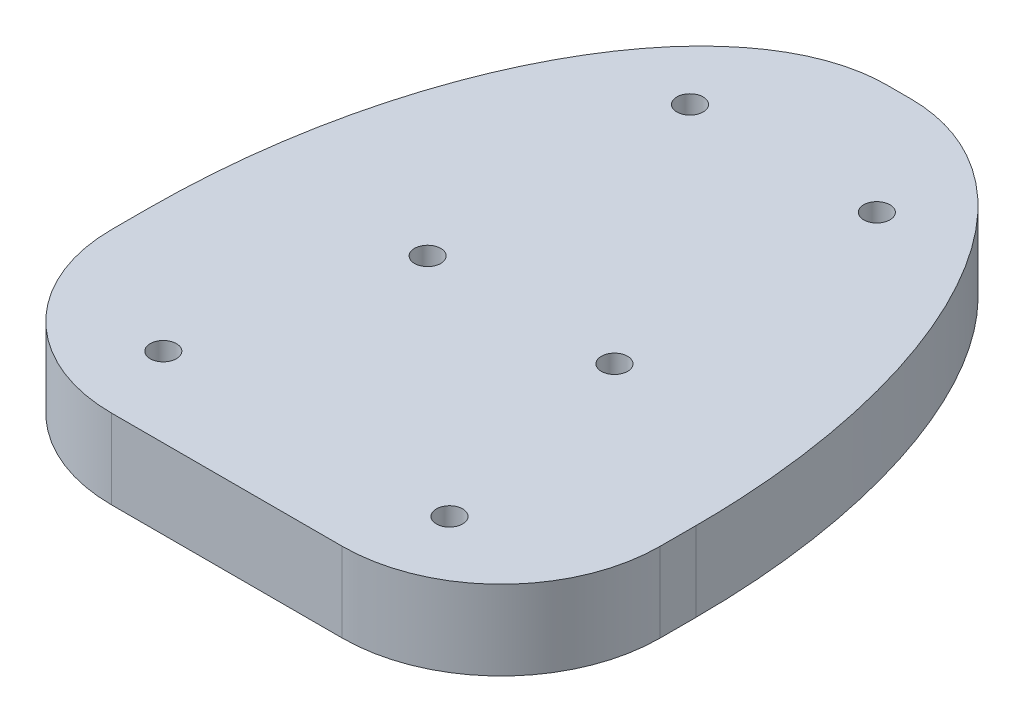
ISO-10303-21;
HEADER;
FILE_DESCRIPTION(('STEP AP214'),'2;1');
FILE_NAME('part.step','',(''),(''),'','','');
FILE_SCHEMA(('AUTOMOTIVE_DESIGN { 1 0 10303 214 1 1 1 1 }'));
ENDSEC;
DATA;
#1=APPLICATION_CONTEXT('core data for automotive mechanical design processes');
#2=APPLICATION_PROTOCOL_DEFINITION('international standard','automotive_design',2000,#1);
#3=PRODUCT_CONTEXT('',#1,'mechanical');
#4=PRODUCT('Part','Part','',(#3));
#5=PRODUCT_RELATED_PRODUCT_CATEGORY('part','',(#4));
#6=PRODUCT_DEFINITION_FORMATION('','',#4);
#7=PRODUCT_DEFINITION_CONTEXT('part definition',#1,'design');
#8=PRODUCT_DEFINITION('design','',#6,#7);
#9=PRODUCT_DEFINITION_SHAPE('','',#8);
#10=(LENGTH_UNIT() NAMED_UNIT(*) SI_UNIT(.MILLI.,.METRE.));
#11=(NAMED_UNIT(*) PLANE_ANGLE_UNIT() SI_UNIT($,.RADIAN.));
#12=(NAMED_UNIT(*) SI_UNIT($,.STERADIAN.) SOLID_ANGLE_UNIT());
#13=UNCERTAINTY_MEASURE_WITH_UNIT(LENGTH_MEASURE(1.E-05),#10,'distance_accuracy_value','');
#14=(GEOMETRIC_REPRESENTATION_CONTEXT(3) GLOBAL_UNCERTAINTY_ASSIGNED_CONTEXT((#13)) GLOBAL_UNIT_ASSIGNED_CONTEXT((#10,
#11,#12)) REPRESENTATION_CONTEXT('',''));
#15=CARTESIAN_POINT('',(0.,0.,0.));
#16=DIRECTION('',(0.,0.,1.));
#17=DIRECTION('',(1.,0.,0.));
#18=AXIS2_PLACEMENT_3D('',#15,#16,#17);
#19=CARTESIAN_POINT('',(-50.,10.,50.));
#20=DIRECTION('',(0.,0.,-1.));
#21=DIRECTION('',(-1.,0.,0.));
#22=AXIS2_PLACEMENT_3D('',#19,#20,#21);
#23=PLANE('',#22);
#24=DIRECTION('',(1.,0.,0.));
#25=VECTOR('',#24,1.);
#26=CARTESIAN_POINT('',(-50.,0.,50.));
#27=LINE('',#26,#25);
#28=CARTESIAN_POINT('',(-14.5000000000001,0.,50.));
#29=VERTEX_POINT('',#28);
#30=CARTESIAN_POINT('',(14.5,0.,50.));
#31=VERTEX_POINT('',#30);
#32=EDGE_CURVE('E124',#29,#31,#27,.T.);
#33=ORIENTED_EDGE('',*,*,#32,.T.);
#34=DIRECTION('',(0.,1.,0.));
#35=VECTOR('',#34,1.);
#36=CARTESIAN_POINT('',(14.5,10.,50.));
#37=LINE('',#36,#35);
#38=CARTESIAN_POINT('',(14.5,10.,50.));
#39=VERTEX_POINT('',#38);
#40=EDGE_CURVE('E131',#31,#39,#37,.T.);
#41=ORIENTED_EDGE('',*,*,#40,.T.);
#42=DIRECTION('',(1.,0.,0.));
#43=VECTOR('',#42,1.);
#44=CARTESIAN_POINT('',(-50.,10.,50.));
#45=LINE('',#44,#43);
#46=CARTESIAN_POINT('',(-14.5000000000001,10.,50.));
#47=VERTEX_POINT('',#46);
#48=EDGE_CURVE('E127',#47,#39,#45,.T.);
#49=ORIENTED_EDGE('',*,*,#48,.F.);
#50=DIRECTION('',(0.,1.,0.));
#51=VECTOR('',#50,1.);
#52=CARTESIAN_POINT('',(-14.5000000000001,0.,50.));
#53=LINE('',#52,#51);
#54=EDGE_CURVE('E121',#47,#29,#53,.F.);
#55=ORIENTED_EDGE('',*,*,#54,.T.);
#56=EDGE_LOOP('',(#33,#41,#49,#55));
#57=FACE_BOUND('',#56,.T.);
#58=ADVANCED_FACE('F47',(#57),#23,.F.);
#59=CARTESIAN_POINT('',(0.,10.,0.));
#60=DIRECTION('',(0.,-1.,0.));
#61=DIRECTION('',(0.,0.,-1.));
#62=AXIS2_PLACEMENT_3D('',#59,#60,#61);
#63=PLANE('',#62);
#64=CARTESIAN_POINT('',(-11.7500000000001,10.,-20.));
#65=DIRECTION('',(0.,1.,0.));
#66=DIRECTION('',(0.,0.,1.));
#67=AXIS2_PLACEMENT_3D('',#64,#65,#66);
#68=CIRCLE('',#67,1.65);
#69=CARTESIAN_POINT('',(-11.7500000000001,10.,-18.35));
#70=VERTEX_POINT('',#69);
#71=EDGE_CURVE('E402',#70,#70,#68,.T.);
#72=ORIENTED_EDGE('',*,*,#71,.F.);
#73=EDGE_LOOP('',(#72));
#74=FACE_BOUND('',#73,.T.);
#75=CARTESIAN_POINT('',(-11.7500000000001,10.,13.));
#76=DIRECTION('',(0.,1.,0.));
#77=DIRECTION('',(0.,0.,1.));
#78=AXIS2_PLACEMENT_3D('',#75,#76,#77);
#79=CIRCLE('',#78,1.65);
#80=CARTESIAN_POINT('',(-11.7500000000001,10.,14.65));
#81=VERTEX_POINT('',#80);
#82=EDGE_CURVE('E251',#81,#81,#79,.T.);
#83=ORIENTED_EDGE('',*,*,#82,.F.);
#84=EDGE_LOOP('',(#83));
#85=FACE_BOUND('',#84,.T.);
#86=CARTESIAN_POINT('',(-18.,10.,40.));
#87=DIRECTION('',(0.,1.,0.));
#88=DIRECTION('',(0.,0.,1.));
#89=AXIS2_PLACEMENT_3D('',#86,#87,#88);
#90=CIRCLE('',#89,1.65);
#91=CARTESIAN_POINT('',(-18.,10.,41.65));
#92=VERTEX_POINT('',#91);
#93=EDGE_CURVE('E408',#92,#92,#90,.T.);
#94=ORIENTED_EDGE('',*,*,#93,.F.);
#95=EDGE_LOOP('',(#94));
#96=FACE_BOUND('',#95,.T.);
#97=CARTESIAN_POINT('',(18.,10.,40.));
#98=DIRECTION('',(0.,1.,0.));
#99=DIRECTION('',(0.,0.,1.));
#100=AXIS2_PLACEMENT_3D('',#97,#98,#99);
#101=CIRCLE('',#100,1.65);
#102=CARTESIAN_POINT('',(18.,10.,41.65));
#103=VERTEX_POINT('',#102);
#104=EDGE_CURVE('E415',#103,#103,#101,.T.);
#105=ORIENTED_EDGE('',*,*,#104,.F.);
#106=EDGE_LOOP('',(#105));
#107=FACE_BOUND('',#106,.T.);
#108=CARTESIAN_POINT('',(11.7499999999999,10.,13.));
#109=DIRECTION('',(0.,1.,0.));
#110=DIRECTION('',(0.,0.,1.));
#111=AXIS2_PLACEMENT_3D('',#108,#109,#110);
#112=CIRCLE('',#111,1.65);
#113=CARTESIAN_POINT('',(11.7499999999999,10.,14.65));
#114=VERTEX_POINT('',#113);
#115=EDGE_CURVE('E421',#114,#114,#112,.T.);
#116=ORIENTED_EDGE('',*,*,#115,.F.);
#117=EDGE_LOOP('',(#116));
#118=FACE_BOUND('',#117,.T.);
#119=CARTESIAN_POINT('',(11.7499999999999,10.,-20.));
#120=DIRECTION('',(0.,1.,0.));
#121=DIRECTION('',(0.,0.,1.));
#122=AXIS2_PLACEMENT_3D('',#119,#120,#121);
#123=CIRCLE('',#122,1.65);
#124=CARTESIAN_POINT('',(11.7499999999999,10.,-18.35));
#125=VERTEX_POINT('',#124);
#126=EDGE_CURVE('E427',#125,#125,#123,.T.);
#127=ORIENTED_EDGE('',*,*,#126,.F.);
#128=EDGE_LOOP('',(#127));
#129=FACE_BOUND('',#128,.T.);
#130=DIRECTION('',(0.,0.,-1.));
#131=VECTOR('',#130,1.);
#132=CARTESIAN_POINT('',(34.5,10.,50.));
#133=LINE('',#132,#131);
#134=CARTESIAN_POINT('',(34.5,10.,30.));
#135=VERTEX_POINT('',#134);
#136=CARTESIAN_POINT('',(34.5,10.,25.4999999998224));
#137=VERTEX_POINT('',#136);
#138=EDGE_CURVE('E154',#135,#137,#133,.T.);
#139=ORIENTED_EDGE('',*,*,#138,.T.);
#140=CARTESIAN_POINT('',(1.50000000000001,10.,-34.5000000001775));
#141=CARTESIAN_POINT('',(34.5,10.,-34.5000000001775));
#142=CARTESIAN_POINT('',(34.5,10.,25.4999999998224));
#143=(BOUNDED_CURVE() B_SPLINE_CURVE(2,(#140,#141,#142),.UNSPECIFIED.,.F.,
.F.) B_SPLINE_CURVE_WITH_KNOTS((3,3),(0.,1.),
.UNSPECIFIED.) CURVE() GEOMETRIC_REPRESENTATION_ITEM() RATIONAL_B_SPLINE_CURVE((1.,
0.707106781186548,1.)) REPRESENTATION_ITEM(''));
#144=CARTESIAN_POINT('',(1.50000000000001,10.,-34.5000000001775));
#145=VERTEX_POINT('',#144);
#146=EDGE_CURVE('E284',#137,#145,#143,.F.);
#147=ORIENTED_EDGE('',*,*,#146,.T.);
#148=DIRECTION('',(-1.,0.,0.));
#149=VECTOR('',#148,1.);
#150=CARTESIAN_POINT('',(34.5,10.,-34.5000000001775));
#151=LINE('',#150,#149);
#152=CARTESIAN_POINT('',(-1.50000000000006,10.,-34.5000000001775));
#153=VERTEX_POINT('',#152);
#154=EDGE_CURVE('E158',#145,#153,#151,.T.);
#155=ORIENTED_EDGE('',*,*,#154,.T.);
#156=CARTESIAN_POINT('',(-34.5000000000001,10.,25.4999999998225));
#157=CARTESIAN_POINT('',(-34.5000000000001,10.,-34.5000000001775));
#158=CARTESIAN_POINT('',(-1.50000000000006,10.,-34.5000000001775));
#159=(BOUNDED_CURVE() B_SPLINE_CURVE(2,(#156,#157,#158),.UNSPECIFIED.,.F.,
.F.) B_SPLINE_CURVE_WITH_KNOTS((3,3),(0.,1.),
.UNSPECIFIED.) CURVE() GEOMETRIC_REPRESENTATION_ITEM() RATIONAL_B_SPLINE_CURVE((1.,
0.707106781186547,1.)) REPRESENTATION_ITEM(''));
#160=CARTESIAN_POINT('',(-34.5000000000001,10.,25.4999999998225));
#161=VERTEX_POINT('',#160);
#162=EDGE_CURVE('E182',#153,#161,#159,.F.);
#163=ORIENTED_EDGE('',*,*,#162,.T.);
#164=DIRECTION('',(0.,0.,1.));
#165=VECTOR('',#164,1.);
#166=CARTESIAN_POINT('',(-34.5,10.,50.));
#167=LINE('',#166,#165);
#168=CARTESIAN_POINT('',(-34.5000000000001,10.,30.));
#169=VERTEX_POINT('',#168);
#170=EDGE_CURVE('E175',#161,#169,#167,.T.);
#171=ORIENTED_EDGE('',*,*,#170,.T.);
#172=CARTESIAN_POINT('',(-14.5000000000001,10.,30.));
#173=DIRECTION('',(0.,-1.,0.));
#174=DIRECTION('',(0.,0.,-1.));
#175=AXIS2_PLACEMENT_3D('',#172,#173,#174);
#176=CIRCLE('',#175,20.);
#177=EDGE_CURVE('E378',#169,#47,#176,.F.);
#178=ORIENTED_EDGE('',*,*,#177,.T.);
#179=ORIENTED_EDGE('',*,*,#48,.T.);
#180=CARTESIAN_POINT('',(14.5,10.,30.));
#181=DIRECTION('',(0.,-1.,0.));
#182=DIRECTION('',(0.,0.,-1.));
#183=AXIS2_PLACEMENT_3D('',#180,#181,#182);
#184=CIRCLE('',#183,20.);
#185=EDGE_CURVE('E148',#39,#135,#184,.F.);
#186=ORIENTED_EDGE('',*,*,#185,.T.);
#187=EDGE_LOOP('',(#139,#147,#155,#163,#171,#178,#179,#186));
#188=FACE_BOUND('',#187,.T.);
#189=ADVANCED_FACE('F188',(#74,#85,#96,#107,#118,#129,#188),#63,.F.);
#190=CARTESIAN_POINT('',(0.,0.,0.));
#191=DIRECTION('',(0.,-1.,0.));
#192=DIRECTION('',(0.,0.,-1.));
#193=AXIS2_PLACEMENT_3D('',#190,#191,#192);
#194=PLANE('',#193);
#195=CARTESIAN_POINT('',(11.7499999999999,0.,-20.));
#196=DIRECTION('',(0.,1.,0.));
#197=DIRECTION('',(0.,0.,1.));
#198=AXIS2_PLACEMENT_3D('',#195,#196,#197);
#199=CIRCLE('',#198,1.65);
#200=CARTESIAN_POINT('',(11.7499999999999,0.,-18.35));
#201=VERTEX_POINT('',#200);
#202=EDGE_CURVE('E405',#201,#201,#199,.T.);
#203=ORIENTED_EDGE('',*,*,#202,.T.);
#204=EDGE_LOOP('',(#203));
#205=FACE_BOUND('',#204,.T.);
#206=CARTESIAN_POINT('',(11.7499999999999,0.,13.));
#207=DIRECTION('',(0.,1.,0.));
#208=DIRECTION('',(0.,0.,1.));
#209=AXIS2_PLACEMENT_3D('',#206,#207,#208);
#210=CIRCLE('',#209,1.65);
#211=CARTESIAN_POINT('',(11.7499999999999,0.,14.65));
#212=VERTEX_POINT('',#211);
#213=EDGE_CURVE('E424',#212,#212,#210,.T.);
#214=ORIENTED_EDGE('',*,*,#213,.T.);
#215=EDGE_LOOP('',(#214));
#216=FACE_BOUND('',#215,.T.);
#217=CARTESIAN_POINT('',(18.,0.,40.));
#218=DIRECTION('',(0.,1.,0.));
#219=DIRECTION('',(0.,0.,1.));
#220=AXIS2_PLACEMENT_3D('',#217,#218,#219);
#221=CIRCLE('',#220,1.65);
#222=CARTESIAN_POINT('',(18.,0.,41.65));
#223=VERTEX_POINT('',#222);
#224=EDGE_CURVE('E418',#223,#223,#221,.T.);
#225=ORIENTED_EDGE('',*,*,#224,.T.);
#226=EDGE_LOOP('',(#225));
#227=FACE_BOUND('',#226,.T.);
#228=CARTESIAN_POINT('',(-18.,0.,40.));
#229=DIRECTION('',(0.,1.,0.));
#230=DIRECTION('',(0.,0.,1.));
#231=AXIS2_PLACEMENT_3D('',#228,#229,#230);
#232=CIRCLE('',#231,1.65);
#233=CARTESIAN_POINT('',(-18.,0.,41.65));
#234=VERTEX_POINT('',#233);
#235=EDGE_CURVE('E411',#234,#234,#232,.T.);
#236=ORIENTED_EDGE('',*,*,#235,.T.);
#237=EDGE_LOOP('',(#236));
#238=FACE_BOUND('',#237,.T.);
#239=CARTESIAN_POINT('',(-11.7500000000001,0.,13.));
#240=DIRECTION('',(0.,1.,0.));
#241=DIRECTION('',(0.,0.,1.));
#242=AXIS2_PLACEMENT_3D('',#239,#240,#241);
#243=CIRCLE('',#242,1.65);
#244=CARTESIAN_POINT('',(-11.7500000000001,0.,14.65));
#245=VERTEX_POINT('',#244);
#246=EDGE_CURVE('E412',#245,#245,#243,.T.);
#247=ORIENTED_EDGE('',*,*,#246,.T.);
#248=EDGE_LOOP('',(#247));
#249=FACE_BOUND('',#248,.T.);
#250=CARTESIAN_POINT('',(-11.7500000000001,0.,-20.));
#251=DIRECTION('',(0.,1.,0.));
#252=DIRECTION('',(0.,0.,1.));
#253=AXIS2_PLACEMENT_3D('',#250,#251,#252);
#254=CIRCLE('',#253,1.65);
#255=CARTESIAN_POINT('',(-11.7500000000001,0.,-18.35));
#256=VERTEX_POINT('',#255);
#257=EDGE_CURVE('E391',#256,#256,#254,.T.);
#258=ORIENTED_EDGE('',*,*,#257,.T.);
#259=EDGE_LOOP('',(#258));
#260=FACE_BOUND('',#259,.T.);
#261=CARTESIAN_POINT('',(26.5,0.,28.4999999998224));
#262=DIRECTION('',(0.,-1.,0.));
#263=DIRECTION('',(0.,0.,-1.));
#264=AXIS2_PLACEMENT_3D('',#261,#262,#263);
#265=CIRCLE('',#264,4.005);
#266=CARTESIAN_POINT('',(26.5,0.,24.4949999998224));
#267=VERTEX_POINT('',#266);
#268=EDGE_CURVE('E395',#267,#267,#265,.T.);
#269=ORIENTED_EDGE('',*,*,#268,.F.);
#270=EDGE_LOOP('',(#269));
#271=FACE_BOUND('',#270,.T.);
#272=CARTESIAN_POINT('',(-26.5000000000002,0.,28.4999999998224));
#273=DIRECTION('',(0.,-1.,0.));
#274=DIRECTION('',(0.,0.,-1.));
#275=AXIS2_PLACEMENT_3D('',#272,#273,#274);
#276=CIRCLE('',#275,4.005);
#277=CARTESIAN_POINT('',(-26.5000000000002,0.,24.4949999998224));
#278=VERTEX_POINT('',#277);
#279=EDGE_CURVE('E387',#278,#278,#276,.T.);
#280=ORIENTED_EDGE('',*,*,#279,.F.);
#281=EDGE_LOOP('',(#280));
#282=FACE_BOUND('',#281,.T.);
#283=CARTESIAN_POINT('',(0.,0.,-26.5000000001776));
#284=DIRECTION('',(0.,-1.,0.));
#285=DIRECTION('',(0.,0.,-1.));
#286=AXIS2_PLACEMENT_3D('',#283,#284,#285);
#287=CIRCLE('',#286,4.005);
#288=CARTESIAN_POINT('',(0.,0.,-30.5050000001776));
#289=VERTEX_POINT('',#288);
#290=EDGE_CURVE('E388',#289,#289,#287,.T.);
#291=ORIENTED_EDGE('',*,*,#290,.F.);
#292=EDGE_LOOP('',(#291));
#293=FACE_BOUND('',#292,.T.);
#294=DIRECTION('',(-1.,0.,0.));
#295=VECTOR('',#294,1.);
#296=CARTESIAN_POINT('',(34.5,0.,-34.5000000001775));
#297=LINE('',#296,#295);
#298=CARTESIAN_POINT('',(1.50000000000001,0.,-34.5000000001775));
#299=VERTEX_POINT('',#298);
#300=CARTESIAN_POINT('',(-1.50000000000006,0.,-34.5000000001775));
#301=VERTEX_POINT('',#300);
#302=EDGE_CURVE('E207',#299,#301,#297,.T.);
#303=ORIENTED_EDGE('',*,*,#302,.F.);
#304=CARTESIAN_POINT('',(34.5,0.,25.4999999998224));
#305=CARTESIAN_POINT('',(34.5,0.,-34.5000000001775));
#306=CARTESIAN_POINT('',(1.50000000000001,0.,-34.5000000001775));
#307=(BOUNDED_CURVE() B_SPLINE_CURVE(2,(#304,#305,#306),.UNSPECIFIED.,.F.,
.F.) B_SPLINE_CURVE_WITH_KNOTS((3,3),(0.,1.),
.UNSPECIFIED.) CURVE() GEOMETRIC_REPRESENTATION_ITEM() RATIONAL_B_SPLINE_CURVE((1.,
0.707106781186548,1.)) REPRESENTATION_ITEM(''));
#308=CARTESIAN_POINT('',(34.5,0.,25.4999999998224));
#309=VERTEX_POINT('',#308);
#310=EDGE_CURVE('E61',#299,#309,#307,.F.);
#311=ORIENTED_EDGE('',*,*,#310,.T.);
#312=DIRECTION('',(0.,0.,-1.));
#313=VECTOR('',#312,1.);
#314=CARTESIAN_POINT('',(34.5,0.,50.));
#315=LINE('',#314,#313);
#316=CARTESIAN_POINT('',(34.5,0.,30.));
#317=VERTEX_POINT('',#316);
#318=EDGE_CURVE('E159',#317,#309,#315,.T.);
#319=ORIENTED_EDGE('',*,*,#318,.F.);
#320=CARTESIAN_POINT('',(14.5,0.,30.));
#321=DIRECTION('',(0.,-1.,0.));
#322=DIRECTION('',(0.,0.,-1.));
#323=AXIS2_PLACEMENT_3D('',#320,#321,#322);
#324=CIRCLE('',#323,20.);
#325=EDGE_CURVE('E139',#317,#31,#324,.T.);
#326=ORIENTED_EDGE('',*,*,#325,.T.);
#327=ORIENTED_EDGE('',*,*,#32,.F.);
#328=CARTESIAN_POINT('',(-14.5000000000001,0.,30.));
#329=DIRECTION('',(0.,-1.,0.));
#330=DIRECTION('',(0.,0.,-1.));
#331=AXIS2_PLACEMENT_3D('',#328,#329,#330);
#332=CIRCLE('',#331,20.);
#333=CARTESIAN_POINT('',(-34.5000000000001,0.,30.));
#334=VERTEX_POINT('',#333);
#335=EDGE_CURVE('E135',#29,#334,#332,.T.);
#336=ORIENTED_EDGE('',*,*,#335,.T.);
#337=DIRECTION('',(0.,0.,1.));
#338=VECTOR('',#337,1.);
#339=CARTESIAN_POINT('',(-34.5,0.,50.));
#340=LINE('',#339,#338);
#341=CARTESIAN_POINT('',(-34.5000000000001,0.,25.4999999998225));
#342=VERTEX_POINT('',#341);
#343=EDGE_CURVE('E214',#342,#334,#340,.T.);
#344=ORIENTED_EDGE('',*,*,#343,.F.);
#345=CARTESIAN_POINT('',(-1.50000000000006,0.,-34.5000000001775));
#346=CARTESIAN_POINT('',(-34.5000000000001,0.,-34.5000000001775));
#347=CARTESIAN_POINT('',(-34.5000000000001,0.,25.4999999998225));
#348=(BOUNDED_CURVE() B_SPLINE_CURVE(2,(#345,#346,#347),.UNSPECIFIED.,.F.,
.F.) B_SPLINE_CURVE_WITH_KNOTS((3,3),(0.,1.),
.UNSPECIFIED.) CURVE() GEOMETRIC_REPRESENTATION_ITEM() RATIONAL_B_SPLINE_CURVE((1.,
0.707106781186547,1.)) REPRESENTATION_ITEM(''));
#349=EDGE_CURVE('E74',#342,#301,#348,.F.);
#350=ORIENTED_EDGE('',*,*,#349,.T.);
#351=EDGE_LOOP('',(#303,#311,#319,#326,#327,#336,#344,#350));
#352=FACE_BOUND('',#351,.T.);
#353=ADVANCED_FACE('F134',(#205,#216,#227,#238,#249,#260,#271,#282,#293,#352),#194,.T.);
#354=CARTESIAN_POINT('',(0.,21.3278506346085,-26.5000000001776));
#355=DIRECTION('',(0.,-1.,0.));
#356=DIRECTION('',(0.,0.,-1.));
#357=AXIS2_PLACEMENT_3D('',#354,#355,#356);
#358=CYLINDRICAL_SURFACE('',#357,4.005);
#359=CARTESIAN_POINT('',(0.,7.,-26.5000000001776));
#360=DIRECTION('',(0.,-1.,0.));
#361=DIRECTION('',(0.,0.,-1.));
#362=AXIS2_PLACEMENT_3D('',#359,#360,#361);
#363=CIRCLE('',#362,4.005);
#364=CARTESIAN_POINT('',(0.,7.,-30.5050000001776));
#365=VERTEX_POINT('',#364);
#366=EDGE_CURVE('E384',#365,#365,#363,.F.);
#367=ORIENTED_EDGE('',*,*,#366,.T.);
#368=EDGE_LOOP('',(#367));
#369=FACE_BOUND('',#368,.T.);
#370=ORIENTED_EDGE('',*,*,#290,.T.);
#371=EDGE_LOOP('',(#370));
#372=FACE_BOUND('',#371,.T.);
#373=ADVANCED_FACE('F199',(#369,#372),#358,.F.);
#374=CARTESIAN_POINT('',(0.,7.,0.));
#375=DIRECTION('',(0.,-1.,0.));
#376=DIRECTION('',(0.,0.,-1.));
#377=AXIS2_PLACEMENT_3D('',#374,#375,#376);
#378=PLANE('',#377);
#379=ORIENTED_EDGE('',*,*,#366,.F.);
#380=EDGE_LOOP('',(#379));
#381=FACE_BOUND('',#380,.T.);
#382=ADVANCED_FACE('F490',(#381),#378,.T.);
#383=CARTESIAN_POINT('',(-26.5000000000002,21.3278506346085,28.4999999998224));
#384=DIRECTION('',(0.,-1.,0.));
#385=DIRECTION('',(0.,0.,-1.));
#386=AXIS2_PLACEMENT_3D('',#383,#384,#385);
#387=CYLINDRICAL_SURFACE('',#386,4.005);
#388=CARTESIAN_POINT('',(-26.5000000000002,7.,28.4999999998224));
#389=DIRECTION('',(0.,-1.,0.));
#390=DIRECTION('',(0.,0.,-1.));
#391=AXIS2_PLACEMENT_3D('',#388,#389,#390);
#392=CIRCLE('',#391,4.005);
#393=CARTESIAN_POINT('',(-26.5000000000002,7.,24.4949999998224));
#394=VERTEX_POINT('',#393);
#395=EDGE_CURVE('E392',#394,#394,#392,.F.);
#396=ORIENTED_EDGE('',*,*,#395,.T.);
#397=EDGE_LOOP('',(#396));
#398=FACE_BOUND('',#397,.T.);
#399=ORIENTED_EDGE('',*,*,#279,.T.);
#400=EDGE_LOOP('',(#399));
#401=FACE_BOUND('',#400,.T.);
#402=ADVANCED_FACE('F487',(#398,#401),#387,.F.);
#403=CARTESIAN_POINT('',(0.,7.,0.));
#404=DIRECTION('',(0.,-1.,0.));
#405=DIRECTION('',(0.,0.,-1.));
#406=AXIS2_PLACEMENT_3D('',#403,#404,#405);
#407=PLANE('',#406);
#408=ORIENTED_EDGE('',*,*,#395,.F.);
#409=EDGE_LOOP('',(#408));
#410=FACE_BOUND('',#409,.T.);
#411=ADVANCED_FACE('F483',(#410),#407,.T.);
#412=CARTESIAN_POINT('',(26.5,21.3278506346085,28.4999999998224));
#413=DIRECTION('',(0.,-1.,0.));
#414=DIRECTION('',(0.,0.,-1.));
#415=AXIS2_PLACEMENT_3D('',#412,#413,#414);
#416=CYLINDRICAL_SURFACE('',#415,4.005);
#417=CARTESIAN_POINT('',(26.5,7.,28.4999999998224));
#418=DIRECTION('',(0.,-1.,0.));
#419=DIRECTION('',(0.,0.,-1.));
#420=AXIS2_PLACEMENT_3D('',#417,#418,#419);
#421=CIRCLE('',#420,4.005);
#422=CARTESIAN_POINT('',(26.5,7.,24.4949999998224));
#423=VERTEX_POINT('',#422);
#424=EDGE_CURVE('E140',#423,#423,#421,.F.);
#425=ORIENTED_EDGE('',*,*,#424,.T.);
#426=EDGE_LOOP('',(#425));
#427=FACE_BOUND('',#426,.T.);
#428=ORIENTED_EDGE('',*,*,#268,.T.);
#429=EDGE_LOOP('',(#428));
#430=FACE_BOUND('',#429,.T.);
#431=ADVANCED_FACE('F479',(#427,#430),#416,.F.);
#432=CARTESIAN_POINT('',(0.,7.,0.));
#433=DIRECTION('',(0.,-1.,0.));
#434=DIRECTION('',(0.,0.,-1.));
#435=AXIS2_PLACEMENT_3D('',#432,#433,#434);
#436=PLANE('',#435);
#437=ORIENTED_EDGE('',*,*,#424,.F.);
#438=EDGE_LOOP('',(#437));
#439=FACE_BOUND('',#438,.T.);
#440=ADVANCED_FACE('F475',(#439),#436,.T.);
#441=CARTESIAN_POINT('',(-11.7500000000001,0.,-20.));
#442=DIRECTION('',(0.,1.,0.));
#443=DIRECTION('',(0.,0.,1.));
#444=AXIS2_PLACEMENT_3D('',#441,#442,#443);
#445=CYLINDRICAL_SURFACE('',#444,1.65);
#446=ORIENTED_EDGE('',*,*,#257,.F.);
#447=EDGE_LOOP('',(#446));
#448=FACE_BOUND('',#447,.T.);
#449=ORIENTED_EDGE('',*,*,#71,.T.);
#450=EDGE_LOOP('',(#449));
#451=FACE_BOUND('',#450,.T.);
#452=ADVANCED_FACE('F442',(#448,#451),#445,.F.);
#453=CARTESIAN_POINT('',(-11.7500000000001,0.,13.));
#454=DIRECTION('',(0.,1.,0.));
#455=DIRECTION('',(0.,0.,1.));
#456=AXIS2_PLACEMENT_3D('',#453,#454,#455);
#457=CYLINDRICAL_SURFACE('',#456,1.65);
#458=ORIENTED_EDGE('',*,*,#246,.F.);
#459=EDGE_LOOP('',(#458));
#460=FACE_BOUND('',#459,.T.);
#461=ORIENTED_EDGE('',*,*,#82,.T.);
#462=EDGE_LOOP('',(#461));
#463=FACE_BOUND('',#462,.T.);
#464=ADVANCED_FACE('F438',(#460,#463),#457,.F.);
#465=CARTESIAN_POINT('',(-18.,0.,40.));
#466=DIRECTION('',(0.,1.,0.));
#467=DIRECTION('',(0.,0.,1.));
#468=AXIS2_PLACEMENT_3D('',#465,#466,#467);
#469=CYLINDRICAL_SURFACE('',#468,1.65);
#470=ORIENTED_EDGE('',*,*,#235,.F.);
#471=EDGE_LOOP('',(#470));
#472=FACE_BOUND('',#471,.T.);
#473=ORIENTED_EDGE('',*,*,#93,.T.);
#474=EDGE_LOOP('',(#473));
#475=FACE_BOUND('',#474,.T.);
#476=ADVANCED_FACE('F441',(#472,#475),#469,.F.);
#477=CARTESIAN_POINT('',(18.,0.,40.));
#478=DIRECTION('',(0.,1.,0.));
#479=DIRECTION('',(0.,0.,1.));
#480=AXIS2_PLACEMENT_3D('',#477,#478,#479);
#481=CYLINDRICAL_SURFACE('',#480,1.65);
#482=ORIENTED_EDGE('',*,*,#224,.F.);
#483=EDGE_LOOP('',(#482));
#484=FACE_BOUND('',#483,.T.);
#485=ORIENTED_EDGE('',*,*,#104,.T.);
#486=EDGE_LOOP('',(#485));
#487=FACE_BOUND('',#486,.T.);
#488=ADVANCED_FACE('F462',(#484,#487),#481,.F.);
#489=CARTESIAN_POINT('',(11.7499999999999,0.,13.));
#490=DIRECTION('',(0.,1.,0.));
#491=DIRECTION('',(0.,0.,1.));
#492=AXIS2_PLACEMENT_3D('',#489,#490,#491);
#493=CYLINDRICAL_SURFACE('',#492,1.65);
#494=ORIENTED_EDGE('',*,*,#213,.F.);
#495=EDGE_LOOP('',(#494));
#496=FACE_BOUND('',#495,.T.);
#497=ORIENTED_EDGE('',*,*,#115,.T.);
#498=EDGE_LOOP('',(#497));
#499=FACE_BOUND('',#498,.T.);
#500=ADVANCED_FACE('F456',(#496,#499),#493,.F.);
#501=CARTESIAN_POINT('',(11.7499999999999,0.,-20.));
#502=DIRECTION('',(0.,1.,0.));
#503=DIRECTION('',(0.,0.,1.));
#504=AXIS2_PLACEMENT_3D('',#501,#502,#503);
#505=CYLINDRICAL_SURFACE('',#504,1.65);
#506=ORIENTED_EDGE('',*,*,#202,.F.);
#507=EDGE_LOOP('',(#506));
#508=FACE_BOUND('',#507,.T.);
#509=ORIENTED_EDGE('',*,*,#126,.T.);
#510=EDGE_LOOP('',(#509));
#511=FACE_BOUND('',#510,.T.);
#512=ADVANCED_FACE('F454',(#508,#511),#505,.F.);
#513=CARTESIAN_POINT('',(-34.5,0.,50.));
#514=DIRECTION('',(-1.,0.,0.));
#515=DIRECTION('',(0.,0.,1.));
#516=AXIS2_PLACEMENT_3D('',#513,#514,#515);
#517=PLANE('',#516);
#518=ORIENTED_EDGE('',*,*,#170,.F.);
#519=CARTESIAN_POINT('',(-34.5000000000001,-0.5,25.4999999998225));
#520=CARTESIAN_POINT('',(-34.5000000000001,3.16666666666666,25.4999999998225));
#521=CARTESIAN_POINT('',(-34.5000000000001,6.83333333333334,25.4999999998225));
#522=CARTESIAN_POINT('',(-34.5000000000001,10.5,25.4999999998225));
#523=(BOUNDED_CURVE() B_SPLINE_CURVE(3,(#519,#520,#521,#522),.UNSPECIFIED.,.F.,
.F.) B_SPLINE_CURVE_WITH_KNOTS((4,4),(-0.0005,0.0105),
.UNSPECIFIED.) CURVE() GEOMETRIC_REPRESENTATION_ITEM() RATIONAL_B_SPLINE_CURVE((1.,1.,1.,1.)) REPRESENTATION_ITEM(''));
#524=EDGE_CURVE('E14',#161,#342,#523,.F.);
#525=ORIENTED_EDGE('',*,*,#524,.T.);
#526=ORIENTED_EDGE('',*,*,#343,.T.);
#527=DIRECTION('',(0.,1.,0.));
#528=VECTOR('',#527,1.);
#529=CARTESIAN_POINT('',(-34.5000000000001,10.,30.));
#530=LINE('',#529,#528);
#531=EDGE_CURVE('E144',#334,#169,#530,.T.);
#532=ORIENTED_EDGE('',*,*,#531,.T.);
#533=EDGE_LOOP('',(#518,#525,#526,#532));
#534=FACE_BOUND('',#533,.T.);
#535=ADVANCED_FACE('F238',(#534),#517,.T.);
#536=CARTESIAN_POINT('',(34.5,0.,-34.5000000001775));
#537=DIRECTION('',(0.,0.,-1.));
#538=DIRECTION('',(-1.,0.,0.));
#539=AXIS2_PLACEMENT_3D('',#536,#537,#538);
#540=PLANE('',#539);
#541=ORIENTED_EDGE('',*,*,#154,.F.);
#542=CARTESIAN_POINT('',(1.50000000000001,-0.5,-34.5000000001775));
#543=CARTESIAN_POINT('',(1.50000000000001,3.16666666666666,-34.5000000001775));
#544=CARTESIAN_POINT('',(1.50000000000001,6.83333333333334,-34.5000000001775));
#545=CARTESIAN_POINT('',(1.50000000000001,10.5,-34.5000000001775));
#546=(BOUNDED_CURVE() B_SPLINE_CURVE(3,(#542,#543,#544,#545),.UNSPECIFIED.,.F.,
.F.) B_SPLINE_CURVE_WITH_KNOTS((4,4),(-0.0005,0.0105),
.UNSPECIFIED.) CURVE() GEOMETRIC_REPRESENTATION_ITEM() RATIONAL_B_SPLINE_CURVE((1.,1.,1.,1.)) REPRESENTATION_ITEM(''));
#547=EDGE_CURVE('E326',#145,#299,#546,.F.);
#548=ORIENTED_EDGE('',*,*,#547,.T.);
#549=ORIENTED_EDGE('',*,*,#302,.T.);
#550=CARTESIAN_POINT('',(-1.50000000000006,10.5,-34.5000000001775));
#551=CARTESIAN_POINT('',(-1.50000000000006,6.83333333333334,-34.5000000001775));
#552=CARTESIAN_POINT('',(-1.50000000000006,3.16666666666666,-34.5000000001775));
#553=CARTESIAN_POINT('',(-1.50000000000006,-0.5,-34.5000000001775));
#554=(BOUNDED_CURVE() B_SPLINE_CURVE(3,(#550,#551,#552,#553),.UNSPECIFIED.,.F.,
.F.) B_SPLINE_CURVE_WITH_KNOTS((4,4),(-0.0005,0.0105),
.UNSPECIFIED.) CURVE() GEOMETRIC_REPRESENTATION_ITEM() RATIONAL_B_SPLINE_CURVE((1.,1.,1.,1.)) REPRESENTATION_ITEM(''));
#555=EDGE_CURVE('E222',#301,#153,#554,.F.);
#556=ORIENTED_EDGE('',*,*,#555,.T.);
#557=EDGE_LOOP('',(#541,#548,#549,#556));
#558=FACE_BOUND('',#557,.T.);
#559=ADVANCED_FACE('F228',(#558),#540,.T.);
#560=CARTESIAN_POINT('',(34.5,0.,50.));
#561=DIRECTION('',(1.,0.,0.));
#562=DIRECTION('',(0.,0.,-1.));
#563=AXIS2_PLACEMENT_3D('',#560,#561,#562);
#564=PLANE('',#563);
#565=ORIENTED_EDGE('',*,*,#318,.T.);
#566=CARTESIAN_POINT('',(34.5,10.5,25.4999999998224));
#567=CARTESIAN_POINT('',(34.5,6.83333333333334,25.4999999998224));
#568=CARTESIAN_POINT('',(34.5,3.16666666666666,25.4999999998224));
#569=CARTESIAN_POINT('',(34.5,-0.5,25.4999999998224));
#570=(BOUNDED_CURVE() B_SPLINE_CURVE(3,(#566,#567,#568,#569),.UNSPECIFIED.,.F.,
.F.) B_SPLINE_CURVE_WITH_KNOTS((4,4),(-0.0005,0.0105),
.UNSPECIFIED.) CURVE() GEOMETRIC_REPRESENTATION_ITEM() RATIONAL_B_SPLINE_CURVE((1.,1.,1.,1.)) REPRESENTATION_ITEM(''));
#571=EDGE_CURVE('E153',#309,#137,#570,.F.);
#572=ORIENTED_EDGE('',*,*,#571,.T.);
#573=ORIENTED_EDGE('',*,*,#138,.F.);
#574=DIRECTION('',(0.,1.,0.));
#575=VECTOR('',#574,1.);
#576=CARTESIAN_POINT('',(34.5,0.,30.));
#577=LINE('',#576,#575);
#578=EDGE_CURVE('E145',#135,#317,#577,.F.);
#579=ORIENTED_EDGE('',*,*,#578,.T.);
#580=EDGE_LOOP('',(#565,#572,#573,#579));
#581=FACE_BOUND('',#580,.T.);
#582=ADVANCED_FACE('F237',(#581),#564,.T.);
#583=CARTESIAN_POINT('',(14.5,10.,30.));
#584=DIRECTION('',(0.,-1.,0.));
#585=DIRECTION('',(0.,0.,-1.));
#586=AXIS2_PLACEMENT_3D('',#583,#584,#585);
#587=CYLINDRICAL_SURFACE('',#586,20.);
#588=ORIENTED_EDGE('',*,*,#325,.F.);
#589=ORIENTED_EDGE('',*,*,#578,.F.);
#590=ORIENTED_EDGE('',*,*,#185,.F.);
#591=ORIENTED_EDGE('',*,*,#40,.F.);
#592=EDGE_LOOP('',(#588,#589,#590,#591));
#593=FACE_BOUND('',#592,.T.);
#594=ADVANCED_FACE('F370',(#593),#587,.T.);
#595=CARTESIAN_POINT('',(-14.5000000000001,0.,30.));
#596=DIRECTION('',(0.,-1.,0.));
#597=DIRECTION('',(0.,0.,-1.));
#598=AXIS2_PLACEMENT_3D('',#595,#596,#597);
#599=CYLINDRICAL_SURFACE('',#598,20.);
#600=ORIENTED_EDGE('',*,*,#335,.F.);
#601=ORIENTED_EDGE('',*,*,#54,.F.);
#602=ORIENTED_EDGE('',*,*,#177,.F.);
#603=ORIENTED_EDGE('',*,*,#531,.F.);
#604=EDGE_LOOP('',(#600,#601,#602,#603));
#605=FACE_BOUND('',#604,.T.);
#606=ADVANCED_FACE('F142',(#605),#599,.T.);
#607=CARTESIAN_POINT('',(34.5,-0.5,25.4999999998224));
#608=CARTESIAN_POINT('',(34.5,3.16666666666666,25.4999999998224));
#609=CARTESIAN_POINT('',(34.5,6.83333333333334,25.4999999998224));
#610=CARTESIAN_POINT('',(34.5,10.5,25.4999999998224));
#611=CARTESIAN_POINT('',(34.5,-0.5,-34.5000000001775));
#612=CARTESIAN_POINT('',(34.5,3.16666666666666,-34.5000000001775));
#613=CARTESIAN_POINT('',(34.5,6.83333333333334,-34.5000000001775));
#614=CARTESIAN_POINT('',(34.5,10.5,-34.5000000001775));
#615=CARTESIAN_POINT('',(1.50000000000001,-0.5,-34.5000000001775));
#616=CARTESIAN_POINT('',(1.50000000000001,3.16666666666666,-34.5000000001775));
#617=CARTESIAN_POINT('',(1.50000000000001,6.83333333333334,-34.5000000001775));
#618=CARTESIAN_POINT('',(1.50000000000001,10.5,-34.5000000001775));
#619=(BOUNDED_SURFACE() B_SPLINE_SURFACE(2,3,((#607,#608,#609,#610),(#611,#612,#613,#614),(#615,
#616,#617,#618)),.UNSPECIFIED.,.F.,.F.,.F.) B_SPLINE_SURFACE_WITH_KNOTS((3,3),(4,4),(0.,1.),
(-0.0005,0.0105),.UNSPECIFIED.) GEOMETRIC_REPRESENTATION_ITEM() RATIONAL_B_SPLINE_SURFACE(((1.,
1.,1.,1.),(0.707106781186548,0.707106781186548,0.707106781186548,0.707106781186548),(1.,1.,1.,1.))) REPRESENTATION_ITEM('') SURFACE());
#620=ORIENTED_EDGE('',*,*,#310,.F.);
#621=ORIENTED_EDGE('',*,*,#547,.F.);
#622=ORIENTED_EDGE('',*,*,#146,.F.);
#623=ORIENTED_EDGE('',*,*,#571,.F.);
#624=EDGE_LOOP('',(#620,#621,#622,#623));
#625=FACE_BOUND('',#624,.T.);
#626=ADVANCED_FACE('F291',(#625),#619,.T.);
#627=CARTESIAN_POINT('',(-1.50000000000006,-0.5,-34.5000000001775));
#628=CARTESIAN_POINT('',(-1.50000000000006,3.16666666666666,-34.5000000001775));
#629=CARTESIAN_POINT('',(-1.50000000000006,6.83333333333334,-34.5000000001775));
#630=CARTESIAN_POINT('',(-1.50000000000006,10.5,-34.5000000001775));
#631=CARTESIAN_POINT('',(-34.5000000000001,-0.5,-34.5000000001775));
#632=CARTESIAN_POINT('',(-34.5000000000001,3.16666666666666,-34.5000000001775));
#633=CARTESIAN_POINT('',(-34.5000000000001,6.83333333333334,-34.5000000001775));
#634=CARTESIAN_POINT('',(-34.5000000000001,10.5,-34.5000000001775));
#635=CARTESIAN_POINT('',(-34.5000000000001,-0.5,25.4999999998225));
#636=CARTESIAN_POINT('',(-34.5000000000001,3.16666666666666,25.4999999998225));
#637=CARTESIAN_POINT('',(-34.5000000000001,6.83333333333334,25.4999999998225));
#638=CARTESIAN_POINT('',(-34.5000000000001,10.5,25.4999999998225));
#639=(BOUNDED_SURFACE() B_SPLINE_SURFACE(2,3,((#627,#628,#629,#630),(#631,#632,#633,#634),(#635,
#636,#637,#638)),.UNSPECIFIED.,.F.,.F.,.F.) B_SPLINE_SURFACE_WITH_KNOTS((3,3),(4,4),(0.,1.),
(-0.0005,0.0105),.UNSPECIFIED.) GEOMETRIC_REPRESENTATION_ITEM() RATIONAL_B_SPLINE_SURFACE(((1.,
1.,1.,1.),(0.707106781186547,0.707106781186547,0.707106781186547,0.707106781186547),(1.,1.,1.,1.))) REPRESENTATION_ITEM('') SURFACE());
#640=ORIENTED_EDGE('',*,*,#349,.F.);
#641=ORIENTED_EDGE('',*,*,#524,.F.);
#642=ORIENTED_EDGE('',*,*,#162,.F.);
#643=ORIENTED_EDGE('',*,*,#555,.F.);
#644=EDGE_LOOP('',(#640,#641,#642,#643));
#645=FACE_BOUND('',#644,.T.);
#646=ADVANCED_FACE('F50',(#645),#639,.T.);
#647=CLOSED_SHELL('',(#58,#189,#353,#373,#382,#402,#411,#431,#440,#452,#464,#476,#488,#500,#512,
#535,#559,#582,#594,#606,#626,#646));
#648=MANIFOLD_SOLID_BREP('B2',#647);
#649=ADVANCED_BREP_SHAPE_REPRESENTATION('',(#18,#648),#14);
#650=SHAPE_DEFINITION_REPRESENTATION(#9,#649);
ENDSEC;
END-ISO-10303-21;
